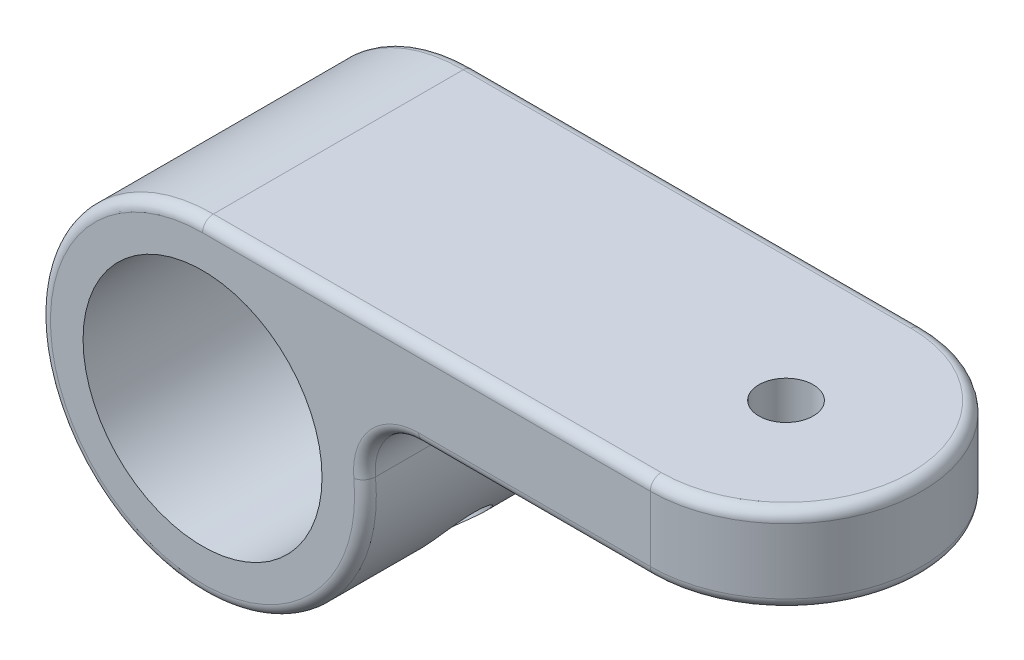
ISO-10303-21;
HEADER;
FILE_DESCRIPTION(('STEP AP214'),'2;1');
FILE_NAME('part.step','',(''),(''),'','','');
FILE_SCHEMA(('AUTOMOTIVE_DESIGN { 1 0 10303 214 1 1 1 1 }'));
ENDSEC;
DATA;
#1=APPLICATION_CONTEXT('core data for automotive mechanical design processes');
#2=APPLICATION_PROTOCOL_DEFINITION('international standard','automotive_design',2000,#1);
#3=PRODUCT_CONTEXT('',#1,'mechanical');
#4=PRODUCT('Part','Part','',(#3));
#5=PRODUCT_RELATED_PRODUCT_CATEGORY('part','',(#4));
#6=PRODUCT_DEFINITION_FORMATION('','',#4);
#7=PRODUCT_DEFINITION_CONTEXT('part definition',#1,'design');
#8=PRODUCT_DEFINITION('design','',#6,#7);
#9=PRODUCT_DEFINITION_SHAPE('','',#8);
#10=(LENGTH_UNIT() NAMED_UNIT(*) SI_UNIT(.MILLI.,.METRE.));
#11=(NAMED_UNIT(*) PLANE_ANGLE_UNIT() SI_UNIT($,.RADIAN.));
#12=(NAMED_UNIT(*) SI_UNIT($,.STERADIAN.) SOLID_ANGLE_UNIT());
#13=UNCERTAINTY_MEASURE_WITH_UNIT(LENGTH_MEASURE(1.E-05),#10,'distance_accuracy_value','');
#14=(GEOMETRIC_REPRESENTATION_CONTEXT(3) GLOBAL_UNCERTAINTY_ASSIGNED_CONTEXT((#13)) GLOBAL_UNIT_ASSIGNED_CONTEXT((#10,
#11,#12)) REPRESENTATION_CONTEXT('',''));
#15=CARTESIAN_POINT('',(0.,0.,0.));
#16=DIRECTION('',(0.,0.,1.));
#17=DIRECTION('',(1.,0.,0.));
#18=AXIS2_PLACEMENT_3D('',#15,#16,#17);
#19=CARTESIAN_POINT('',(0.,0.,12.5));
#20=DIRECTION('',(0.,0.,-1.));
#21=DIRECTION('',(-1.,0.,0.));
#22=AXIS2_PLACEMENT_3D('',#19,#20,#21);
#23=CYLINDRICAL_SURFACE('',#22,15.);
#24=CARTESIAN_POINT('',(12.5136251889729,-8.27098450185364,0.));
#25=CARTESIAN_POINT('',(12.5136231749391,-8.27099120273303,0.166693126473467));
#26=CARTESIAN_POINT('',(12.5057949052179,-8.28286904083328,0.33346387000002));
#27=CARTESIAN_POINT('',(12.4745443398884,-8.32985653781329,0.662287515429395));
#28=CARTESIAN_POINT('',(12.4511095665123,-8.36498478580651,0.82433653390794));
#29=CARTESIAN_POINT('',(12.3889022320751,-8.456840736082,1.13891191006263));
#30=CARTESIAN_POINT('',(12.3501449256236,-8.51354695394872,1.29144756459777));
#31=CARTESIAN_POINT('',(12.2576828342267,-8.64613873514985,1.58302453409087));
#32=CARTESIAN_POINT('',(12.203978883533,-8.72202322802096,1.72206660161371));
#33=CARTESIAN_POINT('',(12.0814116568911,-8.89103463466156,1.98468301156158));
#34=CARTESIAN_POINT('',(12.0123647197605,-8.9843680653555,2.10803876365192));
#35=CARTESIAN_POINT('',(11.8603688879889,-9.1840823391761,2.33387260073694));
#36=CARTESIAN_POINT('',(11.7774190195927,-9.29046409606189,2.43634922225158));
#37=CARTESIAN_POINT('',(11.5980841908886,-9.51341451016626,2.61836405288538));
#38=CARTESIAN_POINT('',(11.5015884298046,-9.63006387619198,2.69769454144992));
#39=CARTESIAN_POINT('',(11.2975614028623,-9.8686224108387,2.82982481114441));
#40=CARTESIAN_POINT('',(11.1900311711268,-9.99053108595102,2.88262707570297));
#41=CARTESIAN_POINT('',(10.967904956632,-10.2338569547666,2.95952158085887));
#42=CARTESIAN_POINT('',(10.8534207383304,-10.3552594605481,2.98398293271302));
#43=CARTESIAN_POINT('',(10.6191764386847,-10.5953388716283,3.00465285551495));
#44=CARTESIAN_POINT('',(10.4994168668352,-10.7140160384638,3.00086414893746));
#45=CARTESIAN_POINT('',(10.259898101583,-10.9435657103416,2.96542145935334));
#46=CARTESIAN_POINT('',(10.1401631900744,-11.0545252922318,2.93416506849645));
#47=CARTESIAN_POINT('',(9.90272672222236,-11.267718411485,2.84530490262332));
#48=CARTESIAN_POINT('',(9.78502524743078,-11.369951599517,2.78770007342438));
#49=CARTESIAN_POINT('',(9.55475244369862,-11.5641496484863,2.6474098795582));
#50=CARTESIAN_POINT('',(9.44221811905671,-11.6560457389459,2.56456874668534));
#51=CARTESIAN_POINT('',(9.22689422150497,-11.8272301064103,2.3762727682902));
#52=CARTESIAN_POINT('',(9.12410577185334,-11.9065169308491,2.27081532068846));
#53=CARTESIAN_POINT('',(8.93024573783684,-12.0526232229679,2.03809913367459));
#54=CARTESIAN_POINT('',(8.83940960305019,-12.1192012998987,1.91049243981123));
#55=CARTESIAN_POINT('',(8.67513365367919,-12.2373332344889,1.63825067264775));
#56=CARTESIAN_POINT('',(8.6016941681287,-12.2888868079847,1.49361527735042));
#57=CARTESIAN_POINT('',(8.47513649895263,-12.3765111113931,1.19093750453459));
#58=CARTESIAN_POINT('',(8.42206214143991,-12.412548470249,1.03286709708102));
#59=CARTESIAN_POINT('',(8.33885601052115,-12.4686014783593,0.708086028828028));
#60=CARTESIAN_POINT('',(8.30872124699857,-12.4886192157471,0.54137649714275));
#61=CARTESIAN_POINT('',(8.27312555275861,-12.5122279031537,0.207105426002867));
#62=CARTESIAN_POINT('',(8.26725124556286,-12.5160940747213,0.0396072770689794));
#63=CARTESIAN_POINT('',(8.27931650300805,-12.508116119262,-0.29414466959905));
#64=CARTESIAN_POINT('',(8.29725471728196,-12.4962728830886,-0.460398537356589));
#65=CARTESIAN_POINT('',(8.35581744160039,-12.4571875619039,-0.785305920876705));
#66=CARTESIAN_POINT('',(8.39622276567051,-12.4300942238561,-0.944017029107288));
#67=CARTESIAN_POINT('',(8.49778413555751,-12.3608825792492,-1.25118983708622));
#68=CARTESIAN_POINT('',(8.55894189075471,-12.3187630349648,-1.39965069130716));
#69=CARTESIAN_POINT('',(8.70040429506805,-12.2192680548973,-1.68423932985048));
#70=CARTESIAN_POINT('',(8.78094812014162,-12.1617009251661,-1.82018113890248));
#71=CARTESIAN_POINT('',(8.95757566976217,-12.0321985902071,-2.07392493600274));
#72=CARTESIAN_POINT('',(9.05366099360248,-11.9602619061051,-2.19172505474776));
#73=CARTESIAN_POINT('',(9.25939610818704,-11.8017233327642,-2.40768767755673));
#74=CARTESIAN_POINT('',(9.36923148455564,-11.7149132697107,-2.50552096394999));
#75=CARTESIAN_POINT('',(9.59728466765588,-11.5288227694577,-2.67643764449875));
#76=CARTESIAN_POINT('',(9.71550212211229,-11.429542856196,-2.74952207803434));
#77=CARTESIAN_POINT('',(9.95550541584014,-11.2210965065809,-2.8683866152399));
#78=CARTESIAN_POINT('',(10.0772667813548,-11.1119903052991,-2.91432155467876));
#79=CARTESIAN_POINT('',(10.3209508821267,-10.8860258816469,-2.97807374299153));
#80=CARTESIAN_POINT('',(10.4428735961773,-10.7691685947155,-2.99589437842704));
#81=CARTESIAN_POINT('',(10.6809715994997,-10.5330184409466,-3.00278094288867));
#82=CARTESIAN_POINT('',(10.7972099824029,-10.4138033405241,-2.99234184136868));
#83=CARTESIAN_POINT('',(11.0229563734338,-10.1745511397289,-2.94409814835652));
#84=CARTESIAN_POINT('',(11.1324644661699,-10.0545140497108,-2.90629390095561));
#85=CARTESIAN_POINT('',(11.3418677538826,-9.81768742085471,-2.80461302372524));
#86=CARTESIAN_POINT('',(11.441784238016,-9.70089111908024,-2.74079586560708));
#87=CARTESIAN_POINT('',(11.6302839697484,-9.47408394292961,-2.58896327600667));
#88=CARTESIAN_POINT('',(11.7188663209418,-9.36407360560472,-2.5009459322865));
#89=CARTESIAN_POINT('',(11.8845696945635,-9.15288655743325,-2.30154183881615));
#90=CARTESIAN_POINT('',(11.9614827639581,-9.05188098515442,-2.18980099084868));
#91=CARTESIAN_POINT('',(12.1010609683268,-8.86442413472852,-1.94684927970369));
#92=CARTESIAN_POINT('',(12.1637227245386,-8.77797630925267,-1.81563381156023));
#93=CARTESIAN_POINT('',(12.274650308995,-8.62219395153215,-1.53576204992871));
#94=CARTESIAN_POINT('',(12.3227538008814,-8.5530537855862,-1.38693311663624));
#95=CARTESIAN_POINT('',(12.4030978971502,-8.43612682229833,-1.0772016802197));
#96=CARTESIAN_POINT('',(12.4353528926435,-8.38832065640834,-0.916310283938431));
#97=CARTESIAN_POINT('',(12.4775340324823,-8.32539252049419,-0.629212633671379));
#98=CARTESIAN_POINT('',(12.4910591391634,-8.30504116518194,-0.504643741458127));
#99=CARTESIAN_POINT('',(12.5091053277458,-8.27783484147142,-0.253398136346596));
#100=CARTESIAN_POINT('',(12.5136267200581,-8.2709794077896,-0.126721496266594));
#101=CARTESIAN_POINT('',(12.5136251889729,-8.27098450185364,0.));
#102=B_SPLINE_CURVE_WITH_KNOTS('',3,(#24,#25,#26,#27,#28,#29,#30,#31,#32,#33,#34,#35,#36,#37,
#38,#39,#40,#41,#42,#43,#44,#45,#46,#47,#48,#49,#50,#51,#52,#53,#54,#55,#56,#57,#58,#59,#60,#61,
#62,#63,#64,#65,#66,#67,#68,#69,#70,#71,#72,#73,#74,#75,#76,#77,#78,#79,#80,#81,#82,#83,#84,#85,
#86,#87,#88,#89,#90,#91,#92,#93,#94,#95,#96,#97,#98,#99,#100,#101),.UNSPECIFIED.,.T.,.F.,(4,2,2,
2,2,2,2,2,2,2,2,2,2,2,2,2,2,2,2,2,2,2,2,2,2,2,2,2,2,2,2,2,2,2,2,2,2,2,4),(0.,0.499615391608283,
0.999630717852889,1.49914949382176,1.99864039457959,2.5044675764531,3.01033020106266,
3.52060201312351,4.03082604739679,4.53432746649241,5.03778036348745,5.53406368900612,
6.03036687221251,6.5297977266691,7.02928607310198,7.5374804028745,8.04568434368161,
8.5549758951833,9.06420105048074,9.56471273413781,10.0651960358526,10.5608802534996,
11.056605310632,11.5587917932356,12.0610299861063,12.5709780520035,13.0809046989031,
13.5878944073595,14.0948230407488,14.5929305224406,15.0910317410027,15.5880005122636,
16.0850085640405,16.5900345607679,17.0951801666934,17.6057669573882,18.1158892527059,
18.4957141091448,18.8755258705644),.UNSPECIFIED.);
#103=CARTESIAN_POINT('',(12.5136251889729,-8.27098450185364,0.));
#104=VERTEX_POINT('',#103);
#105=EDGE_CURVE('E232',#104,#104,#102,.T.);
#106=ORIENTED_EDGE('',*,*,#105,.F.);
#107=EDGE_LOOP('',(#106));
#108=FACE_BOUND('',#107,.T.);
#109=DIRECTION('',(0.,0.,-1.));
#110=VECTOR('',#109,1.);
#111=CARTESIAN_POINT('',(14.9248115565993,1.5,12.5));
#112=LINE('',#111,#110);
#113=CARTESIAN_POINT('',(14.9248115565993,1.5,-11.5));
#114=VERTEX_POINT('',#113);
#115=CARTESIAN_POINT('',(14.9248115565993,1.5,11.5));
#116=VERTEX_POINT('',#115);
#117=EDGE_CURVE('E160',#114,#116,#112,.F.);
#118=ORIENTED_EDGE('',*,*,#117,.T.);
#119=CARTESIAN_POINT('',(0.,0.,11.5));
#120=DIRECTION('',(0.,0.,1.));
#121=DIRECTION('',(1.,0.,0.));
#122=AXIS2_PLACEMENT_3D('',#119,#120,#121);
#123=CIRCLE('',#122,15.);
#124=CARTESIAN_POINT('',(0.,15.,11.5));
#125=VERTEX_POINT('',#124);
#126=EDGE_CURVE('E131',#116,#125,#123,.F.);
#127=ORIENTED_EDGE('',*,*,#126,.T.);
#128=DIRECTION('',(0.,0.,1.));
#129=VECTOR('',#128,1.);
#130=CARTESIAN_POINT('',(0.,15.,-12.5));
#131=LINE('',#130,#129);
#132=CARTESIAN_POINT('',(0.,15.,-11.5));
#133=VERTEX_POINT('',#132);
#134=EDGE_CURVE('E137',#133,#125,#131,.T.);
#135=ORIENTED_EDGE('',*,*,#134,.F.);
#136=CARTESIAN_POINT('',(0.,0.,-11.5));
#137=DIRECTION('',(0.,0.,1.));
#138=DIRECTION('',(1.,0.,0.));
#139=AXIS2_PLACEMENT_3D('',#136,#137,#138);
#140=CIRCLE('',#139,15.);
#141=EDGE_CURVE('E123',#133,#114,#140,.T.);
#142=ORIENTED_EDGE('',*,*,#141,.T.);
#143=EDGE_LOOP('',(#118,#127,#135,#142));
#144=FACE_BOUND('',#143,.T.);
#145=ADVANCED_FACE('F34',(#108,#144),#23,.T.);
#146=CARTESIAN_POINT('',(0.,0.,12.5));
#147=DIRECTION('',(0.,0.,1.));
#148=DIRECTION('',(1.,0.,0.));
#149=AXIS2_PLACEMENT_3D('',#146,#147,#148);
#150=PLANE('',#149);
#151=CARTESIAN_POINT('',(0.,0.,12.5));
#152=DIRECTION('',(0.,0.,-1.));
#153=DIRECTION('',(-1.,0.,0.));
#154=AXIS2_PLACEMENT_3D('',#151,#152,#153);
#155=CIRCLE('',#154,11.);
#156=CARTESIAN_POINT('',(-11.,0.,12.5));
#157=VERTEX_POINT('',#156);
#158=EDGE_CURVE('E146',#157,#157,#155,.T.);
#159=ORIENTED_EDGE('',*,*,#158,.T.);
#160=EDGE_LOOP('',(#159));
#161=FACE_BOUND('',#160,.T.);
#162=DIRECTION('',(0.,1.,0.));
#163=VECTOR('',#162,1.);
#164=CARTESIAN_POINT('',(41.2189778502514,7.,12.5));
#165=LINE('',#164,#163);
#166=CARTESIAN_POINT('',(41.2189778502514,8.,12.5));
#167=VERTEX_POINT('',#166);
#168=CARTESIAN_POINT('',(41.2189778502514,14.,12.5));
#169=VERTEX_POINT('',#168);
#170=EDGE_CURVE('E149',#167,#169,#165,.T.);
#171=ORIENTED_EDGE('',*,*,#170,.T.);
#172=DIRECTION('',(1.,0.,0.));
#173=VECTOR('',#172,1.);
#174=CARTESIAN_POINT('',(0.,14.,12.5));
#175=LINE('',#174,#173);
#176=CARTESIAN_POINT('',(0.,14.,12.5));
#177=VERTEX_POINT('',#176);
#178=EDGE_CURVE('E132',#169,#177,#175,.F.);
#179=ORIENTED_EDGE('',*,*,#178,.T.);
#180=CARTESIAN_POINT('',(0.,0.,12.5));
#181=DIRECTION('',(0.,0.,1.));
#182=DIRECTION('',(1.,0.,0.));
#183=AXIS2_PLACEMENT_3D('',#180,#181,#182);
#184=CIRCLE('',#183,14.);
#185=CARTESIAN_POINT('',(13.9298241194927,1.4,12.5));
#186=VERTEX_POINT('',#185);
#187=EDGE_CURVE('E179',#177,#186,#184,.T.);
#188=ORIENTED_EDGE('',*,*,#187,.T.);
#189=CARTESIAN_POINT('',(19.8997487421324,2.,12.5));
#190=DIRECTION('',(0.,0.,1.));
#191=DIRECTION('',(1.,0.,0.));
#192=AXIS2_PLACEMENT_3D('',#189,#190,#191);
#193=CIRCLE('',#192,6.);
#194=CARTESIAN_POINT('',(19.8997487421324,8.,12.5));
#195=VERTEX_POINT('',#194);
#196=EDGE_CURVE('E177',#186,#195,#193,.F.);
#197=ORIENTED_EDGE('',*,*,#196,.T.);
#198=DIRECTION('',(1.,0.,0.));
#199=VECTOR('',#198,1.);
#200=CARTESIAN_POINT('',(41.2189778502514,8.,12.5));
#201=LINE('',#200,#199);
#202=EDGE_CURVE('E175',#195,#167,#201,.T.);
#203=ORIENTED_EDGE('',*,*,#202,.T.);
#204=EDGE_LOOP('',(#171,#179,#188,#197,#203));
#205=FACE_BOUND('',#204,.T.);
#206=ADVANCED_FACE('F253',(#161,#205),#150,.T.);
#207=CARTESIAN_POINT('',(0.,0.,-12.5));
#208=DIRECTION('',(0.,0.,1.));
#209=DIRECTION('',(1.,0.,0.));
#210=AXIS2_PLACEMENT_3D('',#207,#208,#209);
#211=PLANE('',#210);
#212=CARTESIAN_POINT('',(0.,0.,-12.5));
#213=DIRECTION('',(0.,0.,-1.));
#214=DIRECTION('',(-1.,0.,0.));
#215=AXIS2_PLACEMENT_3D('',#212,#213,#214);
#216=CIRCLE('',#215,11.);
#217=CARTESIAN_POINT('',(-11.,0.,-12.5));
#218=VERTEX_POINT('',#217);
#219=EDGE_CURVE('E152',#218,#218,#216,.T.);
#220=ORIENTED_EDGE('',*,*,#219,.F.);
#221=EDGE_LOOP('',(#220));
#222=FACE_BOUND('',#221,.T.);
#223=CARTESIAN_POINT('',(0.,0.,-12.5));
#224=DIRECTION('',(0.,0.,1.));
#225=DIRECTION('',(1.,0.,0.));
#226=AXIS2_PLACEMENT_3D('',#223,#224,#225);
#227=CIRCLE('',#226,14.);
#228=CARTESIAN_POINT('',(13.9298241194927,1.4,-12.5));
#229=VERTEX_POINT('',#228);
#230=CARTESIAN_POINT('',(0.,14.,-12.5));
#231=VERTEX_POINT('',#230);
#232=EDGE_CURVE('E142',#229,#231,#227,.F.);
#233=ORIENTED_EDGE('',*,*,#232,.T.);
#234=DIRECTION('',(-1.,0.,0.));
#235=VECTOR('',#234,1.);
#236=CARTESIAN_POINT('',(41.2189778502514,14.,-12.5));
#237=LINE('',#236,#235);
#238=CARTESIAN_POINT('',(41.2189778502514,14.,-12.5));
#239=VERTEX_POINT('',#238);
#240=EDGE_CURVE('E117',#231,#239,#237,.F.);
#241=ORIENTED_EDGE('',*,*,#240,.T.);
#242=DIRECTION('',(0.,1.,0.));
#243=VECTOR('',#242,1.);
#244=CARTESIAN_POINT('',(41.2189778502514,7.,-12.5));
#245=LINE('',#244,#243);
#246=CARTESIAN_POINT('',(41.2189778502514,8.,-12.5));
#247=VERTEX_POINT('',#246);
#248=EDGE_CURVE('E145',#247,#239,#245,.T.);
#249=ORIENTED_EDGE('',*,*,#248,.F.);
#250=DIRECTION('',(-1.,0.,0.));
#251=VECTOR('',#250,1.);
#252=CARTESIAN_POINT('',(0.,8.,-12.5));
#253=LINE('',#252,#251);
#254=CARTESIAN_POINT('',(19.8997487421324,8.,-12.5));
#255=VERTEX_POINT('',#254);
#256=EDGE_CURVE('E168',#247,#255,#253,.T.);
#257=ORIENTED_EDGE('',*,*,#256,.T.);
#258=CARTESIAN_POINT('',(19.8997487421324,2.,-12.5));
#259=DIRECTION('',(0.,0.,1.));
#260=DIRECTION('',(1.,0.,0.));
#261=AXIS2_PLACEMENT_3D('',#258,#259,#260);
#262=CIRCLE('',#261,6.);
#263=EDGE_CURVE('E166',#255,#229,#262,.T.);
#264=ORIENTED_EDGE('',*,*,#263,.T.);
#265=EDGE_LOOP('',(#233,#241,#249,#257,#264));
#266=FACE_BOUND('',#265,.T.);
#267=ADVANCED_FACE('F259',(#222,#266),#211,.F.);
#268=CARTESIAN_POINT('',(41.2189778502514,7.,0.));
#269=DIRECTION('',(0.,1.,0.));
#270=DIRECTION('',(0.,0.,1.));
#271=AXIS2_PLACEMENT_3D('',#268,#269,#270);
#272=PLANE('',#271);
#273=CARTESIAN_POINT('',(41.2189778502514,7.,0.));
#274=DIRECTION('',(0.,1.,0.));
#275=DIRECTION('',(0.,0.,1.));
#276=AXIS2_PLACEMENT_3D('',#273,#274,#275);
#277=CIRCLE('',#276,2.49999999999999);
#278=CARTESIAN_POINT('',(41.2189778502514,7.,2.49999999999999));
#279=VERTEX_POINT('',#278);
#280=EDGE_CURVE('E217',#279,#279,#277,.T.);
#281=ORIENTED_EDGE('',*,*,#280,.T.);
#282=EDGE_LOOP('',(#281));
#283=FACE_BOUND('',#282,.T.);
#284=CARTESIAN_POINT('',(41.2189778502514,7.,0.));
#285=DIRECTION('',(0.,1.,0.));
#286=DIRECTION('',(0.,0.,1.));
#287=AXIS2_PLACEMENT_3D('',#284,#285,#286);
#288=CIRCLE('',#287,11.5);
#289=CARTESIAN_POINT('',(41.2189778502514,7.,-11.5));
#290=VERTEX_POINT('',#289);
#291=CARTESIAN_POINT('',(41.2189778502514,7.,11.5));
#292=VERTEX_POINT('',#291);
#293=EDGE_CURVE('E43',#290,#292,#288,.F.);
#294=ORIENTED_EDGE('',*,*,#293,.T.);
#295=DIRECTION('',(1.,0.,0.));
#296=VECTOR('',#295,1.);
#297=CARTESIAN_POINT('',(19.8997487421324,7.,11.5));
#298=LINE('',#297,#296);
#299=CARTESIAN_POINT('',(19.8997487421324,7.,11.5));
#300=VERTEX_POINT('',#299);
#301=EDGE_CURVE('E11',#292,#300,#298,.F.);
#302=ORIENTED_EDGE('',*,*,#301,.T.);
#303=DIRECTION('',(0.,0.,1.));
#304=VECTOR('',#303,1.);
#305=CARTESIAN_POINT('',(19.8997487421324,7.,-12.5));
#306=LINE('',#305,#304);
#307=CARTESIAN_POINT('',(19.8997487421324,7.,-11.5));
#308=VERTEX_POINT('',#307);
#309=EDGE_CURVE('E157',#300,#308,#306,.F.);
#310=ORIENTED_EDGE('',*,*,#309,.T.);
#311=DIRECTION('',(-1.,0.,0.));
#312=VECTOR('',#311,1.);
#313=CARTESIAN_POINT('',(41.2189778502514,7.,-11.5));
#314=LINE('',#313,#312);
#315=EDGE_CURVE('E54',#308,#290,#314,.F.);
#316=ORIENTED_EDGE('',*,*,#315,.T.);
#317=EDGE_LOOP('',(#294,#302,#310,#316));
#318=FACE_BOUND('',#317,.T.);
#319=ADVANCED_FACE('F394',(#283,#318),#272,.F.);
#320=CARTESIAN_POINT('',(41.2189778502514,7.,0.));
#321=DIRECTION('',(0.,1.,0.));
#322=DIRECTION('',(0.,0.,1.));
#323=AXIS2_PLACEMENT_3D('',#320,#321,#322);
#324=CYLINDRICAL_SURFACE('',#323,12.5);
#325=ORIENTED_EDGE('',*,*,#248,.T.);
#326=CARTESIAN_POINT('',(41.2189778502514,14.,0.));
#327=DIRECTION('',(0.,1.,0.));
#328=DIRECTION('',(0.,0.,1.));
#329=AXIS2_PLACEMENT_3D('',#326,#327,#328);
#330=CIRCLE('',#329,12.5);
#331=EDGE_CURVE('E173',#239,#169,#330,.F.);
#332=ORIENTED_EDGE('',*,*,#331,.T.);
#333=ORIENTED_EDGE('',*,*,#170,.F.);
#334=CARTESIAN_POINT('',(41.2189778502514,8.,0.));
#335=DIRECTION('',(0.,1.,0.));
#336=DIRECTION('',(0.,0.,1.));
#337=AXIS2_PLACEMENT_3D('',#334,#335,#336);
#338=CIRCLE('',#337,12.5);
#339=EDGE_CURVE('E171',#167,#247,#338,.T.);
#340=ORIENTED_EDGE('',*,*,#339,.T.);
#341=EDGE_LOOP('',(#325,#332,#333,#340));
#342=FACE_BOUND('',#341,.T.);
#343=ADVANCED_FACE('F385',(#342),#324,.T.);
#344=CARTESIAN_POINT('',(41.2189778502514,15.,0.));
#345=DIRECTION('',(0.,1.,0.));
#346=DIRECTION('',(0.,0.,1.));
#347=AXIS2_PLACEMENT_3D('',#344,#345,#346);
#348=PLANE('',#347);
#349=CARTESIAN_POINT('',(41.2189778502514,15.,0.));
#350=DIRECTION('',(0.,1.,0.));
#351=DIRECTION('',(0.,0.,1.));
#352=AXIS2_PLACEMENT_3D('',#349,#350,#351);
#353=CIRCLE('',#352,2.49999999999999);
#354=CARTESIAN_POINT('',(41.2189778502514,15.,2.49999999999999));
#355=VERTEX_POINT('',#354);
#356=EDGE_CURVE('E211',#355,#355,#353,.T.);
#357=ORIENTED_EDGE('',*,*,#356,.F.);
#358=EDGE_LOOP('',(#357));
#359=FACE_BOUND('',#358,.T.);
#360=CARTESIAN_POINT('',(41.2189778502514,15.,0.));
#361=DIRECTION('',(0.,1.,0.));
#362=DIRECTION('',(0.,0.,1.));
#363=AXIS2_PLACEMENT_3D('',#360,#361,#362);
#364=CIRCLE('',#363,11.5);
#365=CARTESIAN_POINT('',(41.2189778502514,15.,11.5));
#366=VERTEX_POINT('',#365);
#367=CARTESIAN_POINT('',(41.2189778502514,15.,-11.5));
#368=VERTEX_POINT('',#367);
#369=EDGE_CURVE('E140',#366,#368,#364,.T.);
#370=ORIENTED_EDGE('',*,*,#369,.T.);
#371=DIRECTION('',(-1.,0.,0.));
#372=VECTOR('',#371,1.);
#373=CARTESIAN_POINT('',(0.,15.,-11.5));
#374=LINE('',#373,#372);
#375=EDGE_CURVE('E115',#368,#133,#374,.T.);
#376=ORIENTED_EDGE('',*,*,#375,.T.);
#377=ORIENTED_EDGE('',*,*,#134,.T.);
#378=DIRECTION('',(1.,0.,0.));
#379=VECTOR('',#378,1.);
#380=CARTESIAN_POINT('',(41.2189778502514,15.,11.5));
#381=LINE('',#380,#379);
#382=EDGE_CURVE('E162',#125,#366,#381,.T.);
#383=ORIENTED_EDGE('',*,*,#382,.T.);
#384=EDGE_LOOP('',(#370,#376,#377,#383));
#385=FACE_BOUND('',#384,.T.);
#386=ADVANCED_FACE('F136',(#359,#385),#348,.T.);
#387=CARTESIAN_POINT('',(19.8997487421324,2.,12.5));
#388=DIRECTION('',(0.,0.,-1.));
#389=DIRECTION('',(-1.,0.,0.));
#390=AXIS2_PLACEMENT_3D('',#387,#388,#389);
#391=CYLINDRICAL_SURFACE('',#390,5.);
#392=ORIENTED_EDGE('',*,*,#309,.F.);
#393=CARTESIAN_POINT('',(19.8997487421324,2.,11.5));
#394=DIRECTION('',(0.,0.,1.));
#395=DIRECTION('',(1.,0.,0.));
#396=AXIS2_PLACEMENT_3D('',#393,#394,#395);
#397=CIRCLE('',#396,5.);
#398=EDGE_CURVE('E185',#300,#116,#397,.T.);
#399=ORIENTED_EDGE('',*,*,#398,.T.);
#400=ORIENTED_EDGE('',*,*,#117,.F.);
#401=CARTESIAN_POINT('',(19.8997487421324,2.,-11.5));
#402=DIRECTION('',(0.,0.,1.));
#403=DIRECTION('',(1.,0.,0.));
#404=AXIS2_PLACEMENT_3D('',#401,#402,#403);
#405=CIRCLE('',#404,5.);
#406=EDGE_CURVE('E183',#114,#308,#405,.F.);
#407=ORIENTED_EDGE('',*,*,#406,.T.);
#408=EDGE_LOOP('',(#392,#399,#400,#407));
#409=FACE_BOUND('',#408,.T.);
#410=ADVANCED_FACE('F265',(#409),#391,.F.);
#411=CARTESIAN_POINT('',(0.,0.,12.5));
#412=DIRECTION('',(0.,0.,-1.));
#413=DIRECTION('',(-1.,0.,0.));
#414=AXIS2_PLACEMENT_3D('',#411,#412,#413);
#415=CYLINDRICAL_SURFACE('',#414,11.);
#416=CARTESIAN_POINT('',(9.60463511710751,-5.36199442998826,0.));
#417=CARTESIAN_POINT('',(9.60463443006475,-5.36199895581847,-0.165112902057717));
#418=CARTESIAN_POINT('',(9.59772579887576,-5.37442811429743,-0.330264219911617));
#419=CARTESIAN_POINT('',(9.57009139923725,-5.42347834183188,-0.655787050599415));
#420=CARTESIAN_POINT('',(9.54935911182632,-5.46011082461969,-0.816156270996935));
#421=CARTESIAN_POINT('',(9.4941303050645,-5.55558302118491,-1.12735837592386));
#422=CARTESIAN_POINT('',(9.45965374301011,-5.61439052916973,-1.27820472180849));
#423=CARTESIAN_POINT('',(9.37696422654692,-5.75142767581114,-1.56671626847336));
#424=CARTESIAN_POINT('',(9.32875002652241,-5.8296590755833,-1.70438027247458));
#425=CARTESIAN_POINT('',(9.2173599453906,-6.00426713170295,-1.96622041358269));
#426=CARTESIAN_POINT('',(9.15385724659032,-6.101029099833,-2.0900006567561));
#427=CARTESIAN_POINT('',(9.01280443023725,-6.30753260241041,-2.31705531545098));
#428=CARTESIAN_POINT('',(8.93525280104236,-6.41727553314685,-2.42032752183202));
#429=CARTESIAN_POINT('',(8.76532438690944,-6.64754638693444,-2.60509725362096));
#430=CARTESIAN_POINT('',(8.6727202469165,-6.76822462890474,-2.68619944365289));
#431=CARTESIAN_POINT('',(8.47499853924056,-7.0142185671129,-2.82174573636573));
#432=CARTESIAN_POINT('',(8.36988318658457,-7.13953343976681,-2.87619454914844));
#433=CARTESIAN_POINT('',(8.151988024963,-7.38726207679906,-2.95560219656108));
#434=CARTESIAN_POINT('',(8.039451509514,-7.50967357949618,-2.98123488842947));
#435=CARTESIAN_POINT('',(7.80749109046237,-7.75054955911131,-3.00440460459591));
#436=CARTESIAN_POINT('',(7.68806839417813,-7.86901472220906,-3.00194653908894));
#437=CARTESIAN_POINT('',(7.44917478303897,-8.09544226846508,-2.96947520270322));
#438=CARTESIAN_POINT('',(7.32978817924872,-8.20359922914751,-2.94019025336151));
#439=CARTESIAN_POINT('',(7.09169119783908,-8.41027848140167,-2.8560753353088));
#440=CARTESIAN_POINT('',(6.9729808600516,-8.50880021087454,-2.8012438773432));
#441=CARTESIAN_POINT('',(6.73895057816217,-8.69535449139913,-2.66704572831408));
#442=CARTESIAN_POINT('',(6.62367790965727,-8.78326906563586,-2.58743310262504));
#443=CARTESIAN_POINT('',(6.40176806439386,-8.94630389009055,-2.40612221146475));
#444=CARTESIAN_POINT('',(6.29513264327777,-9.02142154255979,-2.30441947125565));
#445=CARTESIAN_POINT('',(6.09111038642808,-9.1604650514687,-2.07796400976));
#446=CARTESIAN_POINT('',(5.99412984442713,-9.22395471105038,-1.95257665612493));
#447=CARTESIAN_POINT('',(5.81743993183889,-9.33640141241082,-1.68430956976681));
#448=CARTESIAN_POINT('',(5.73773171689146,-9.38535748187147,-1.54142866760295));
#449=CARTESIAN_POINT('',(5.59875081427746,-9.46893021424181,-1.24089121201835));
#450=CARTESIAN_POINT('',(5.53961876843446,-9.5034485038946,-1.08314198853184));
#451=CARTESIAN_POINT('',(5.44561438023737,-9.55762839778143,-0.758154795623372));
#452=CARTESIAN_POINT('',(5.41073570191186,-9.57729388229131,-0.590919316756091));
#453=CARTESIAN_POINT('',(5.36787312482913,-9.60138156918398,-0.257295636951545));
#454=CARTESIAN_POINT('',(5.35908449500411,-9.60625997284642,-0.091043626450415));
#455=CARTESIAN_POINT('',(5.36659849109299,-9.60206438097145,0.240702287088641));
#456=CARTESIAN_POINT('',(5.38289830626255,-9.59299194839407,0.406196272967353));
#457=CARTESIAN_POINT('',(5.43909622386753,-9.56123567548758,0.728244874614174));
#458=CARTESIAN_POINT('',(5.47850768672521,-9.53883239096619,0.884912841257285));
#459=CARTESIAN_POINT('',(5.57855800688833,-9.48066545399861,1.18869201986353));
#460=CARTESIAN_POINT('',(5.63919972929203,-9.4448999982366,1.335801938756));
#461=CARTESIAN_POINT('',(5.78056013707272,-9.35906466129004,1.62000141633334));
#462=CARTESIAN_POINT('',(5.86170597174865,-9.3086865590557,1.75678514900979));
#463=CARTESIAN_POINT('',(6.03988439192025,-9.19407395959984,2.01313213077045));
#464=CARTESIAN_POINT('',(6.13692010571028,-9.12983673309322,2.1326919802003));
#465=CARTESIAN_POINT('',(6.34626962519233,-8.98562590865305,2.35493272790115));
#466=CARTESIAN_POINT('',(6.4589582109775,-8.90523328719244,2.45699000686839));
#467=CARTESIAN_POINT('',(6.69288449075973,-8.73078195314261,2.63674127018198));
#468=CARTESIAN_POINT('',(6.81412172952374,-8.63672396797917,2.71443655065564));
#469=CARTESIAN_POINT('',(7.05971364851532,-8.43713598728779,2.84253413251583));
#470=CARTESIAN_POINT('',(7.18403717499331,-8.33169980259407,2.89314178060099));
#471=CARTESIAN_POINT('',(7.43226131230088,-8.11104384163859,2.96621390509015));
#472=CARTESIAN_POINT('',(7.55616201481069,-7.99582634772228,2.98868492765384));
#473=CARTESIAN_POINT('',(7.79548710309552,-7.76256500422248,3.00442024018115));
#474=CARTESIAN_POINT('',(7.91105588022206,-7.64473002446613,2.99859734261346));
#475=CARTESIAN_POINT('',(8.13465280004792,-7.40635740962586,2.96004044537997));
#476=CARTESIAN_POINT('',(8.24268124921716,-7.28581988464789,2.92730754013925));
#477=CARTESIAN_POINT('',(8.44787989849338,-7.04684105435847,2.83638525932124));
#478=CARTESIAN_POINT('',(8.54512544285492,-6.92839080813516,2.7783886035202));
#479=CARTESIAN_POINT('',(8.72799122145497,-6.69656573175011,2.63875675692911));
#480=CARTESIAN_POINT('',(8.81360976630816,-6.5831916407467,2.55711813638421));
#481=CARTESIAN_POINT('',(8.97438225385039,-6.36236183553424,2.36989054343922));
#482=CARTESIAN_POINT('',(9.04918146865418,-6.25515638081133,2.26370185513661));
#483=CARTESIAN_POINT('',(9.18486227578806,-6.05417539402211,2.03151572288963));
#484=CARTESIAN_POINT('',(9.24574014429521,-5.96040345778932,1.90551299406044));
#485=CARTESIAN_POINT('',(9.35459100992225,-5.7881150711914,1.63374494637179));
#486=CARTESIAN_POINT('',(9.40223030753362,-5.71000493912968,1.48758759477228));
#487=CARTESIAN_POINT('',(9.4825771695016,-5.57556312371175,1.18182810983632));
#488=CARTESIAN_POINT('',(9.51529407206618,-5.51921782364419,1.02223445901635));
#489=CARTESIAN_POINT('',(9.56190932868506,-5.4379887262448,0.719463961469247));
#490=CARTESIAN_POINT('',(9.57792961484092,-5.40959648201826,0.577543062490048));
#491=CARTESIAN_POINT('',(9.59929213559822,-5.37159853214167,0.290424404201468));
#492=CARTESIAN_POINT('',(9.60463572140434,-5.36199044923923,0.145227061899352));
#493=CARTESIAN_POINT('',(9.60463511710751,-5.36199442998826,0.));
#494=B_SPLINE_CURVE_WITH_KNOTS('',3,(#416,#417,#418,#419,#420,#421,#422,#423,#424,#425,#426,
#427,#428,#429,#430,#431,#432,#433,#434,#435,#436,#437,#438,#439,#440,#441,#442,#443,#444,#445,
#446,#447,#448,#449,#450,#451,#452,#453,#454,#455,#456,#457,#458,#459,#460,#461,#462,#463,#464,
#465,#466,#467,#468,#469,#470,#471,#472,#473,#474,#475,#476,#477,#478,#479,#480,#481,#482,#483,
#484,#485,#486,#487,#488,#489,#490,#491,#492,#493),.UNSPECIFIED.,.T.,.F.,(4,2,2,2,2,2,2,2,2,2,2,
2,2,2,2,2,2,2,2,2,2,2,2,2,2,2,2,2,2,2,2,2,2,2,2,2,2,2,4),(0.,0.494804402783935,
0.989842310673483,1.48416400458282,1.9785305337777,2.48458654001651,2.99069702943608,
3.5053176563917,4.01984730833293,4.52207686042122,5.02421862536768,5.51311924771327,
6.00204837448659,6.49599339426235,6.99003856468468,7.49992833732446,8.00985221464115,
8.52319603663078,9.03640570178773,9.53361223089933,10.0307630603168,10.5178037490719,
11.0049101910351,11.5031485099097,12.0014850368415,12.5149711336561,13.0284299069195,
13.5379390354896,14.0473296015752,14.5403975209342,15.0334453883032,15.5227962513149,
16.0122181403599,16.5151701080202,17.0182564534142,17.5330636246647,18.0475481939114,
18.4828145157885,18.9180257484398),.UNSPECIFIED.);
#495=CARTESIAN_POINT('',(9.60463511710751,-5.36199442998826,0.));
#496=VERTEX_POINT('',#495);
#497=EDGE_CURVE('E222',#496,#496,#494,.T.);
#498=ORIENTED_EDGE('',*,*,#497,.F.);
#499=EDGE_LOOP('',(#498));
#500=FACE_BOUND('',#499,.T.);
#501=ORIENTED_EDGE('',*,*,#158,.F.);
#502=EDGE_LOOP('',(#501));
#503=FACE_BOUND('',#502,.T.);
#504=ORIENTED_EDGE('',*,*,#219,.T.);
#505=EDGE_LOOP('',(#504));
#506=FACE_BOUND('',#505,.T.);
#507=ADVANCED_FACE('F249',(#500,#503,#506),#415,.F.);
#508=CARTESIAN_POINT('',(-15.001,15.001,0.));
#509=DIRECTION('',(0.707106781186546,-0.707106781186549,0.));
#510=DIRECTION('',(0.707106781186549,0.707106781186546,0.));
#511=AXIS2_PLACEMENT_3D('',#508,#509,#510);
#512=CYLINDRICAL_SURFACE('',#511,3.);
#513=ORIENTED_EDGE('',*,*,#497,.T.);
#514=EDGE_LOOP('',(#513));
#515=FACE_BOUND('',#514,.T.);
#516=ORIENTED_EDGE('',*,*,#105,.T.);
#517=EDGE_LOOP('',(#516));
#518=FACE_BOUND('',#517,.T.);
#519=ADVANCED_FACE('F237',(#515,#518),#512,.F.);
#520=CARTESIAN_POINT('',(41.2189778502514,15.,0.));
#521=DIRECTION('',(0.,1.,0.));
#522=DIRECTION('',(0.,0.,1.));
#523=AXIS2_PLACEMENT_3D('',#520,#521,#522);
#524=CYLINDRICAL_SURFACE('',#523,2.49999999999999);
#525=ORIENTED_EDGE('',*,*,#356,.T.);
#526=EDGE_LOOP('',(#525));
#527=FACE_BOUND('',#526,.T.);
#528=ORIENTED_EDGE('',*,*,#280,.F.);
#529=EDGE_LOOP('',(#528));
#530=FACE_BOUND('',#529,.T.);
#531=ADVANCED_FACE('F241',(#527,#530),#524,.F.);
#532=CARTESIAN_POINT('',(0.,8.,11.5));
#533=DIRECTION('',(-1.,0.,0.));
#534=DIRECTION('',(0.,0.,1.));
#535=AXIS2_PLACEMENT_3D('',#532,#533,#534);
#536=CYLINDRICAL_SURFACE('',#535,1.);
#537=CARTESIAN_POINT('',(41.2189778502514,8.,11.5));
#538=DIRECTION('',(1.,0.,0.));
#539=DIRECTION('',(0.,0.,-1.));
#540=AXIS2_PLACEMENT_3D('',#537,#538,#539);
#541=CIRCLE('',#540,1.);
#542=EDGE_CURVE('E205',#167,#292,#541,.T.);
#543=ORIENTED_EDGE('',*,*,#542,.F.);
#544=ORIENTED_EDGE('',*,*,#202,.F.);
#545=CARTESIAN_POINT('',(19.8997487421324,8.,11.5));
#546=DIRECTION('',(-1.,0.,0.));
#547=DIRECTION('',(0.,0.,1.));
#548=AXIS2_PLACEMENT_3D('',#545,#546,#547);
#549=CIRCLE('',#548,1.);
#550=EDGE_CURVE('E38',#300,#195,#549,.T.);
#551=ORIENTED_EDGE('',*,*,#550,.F.);
#552=ORIENTED_EDGE('',*,*,#301,.F.);
#553=EDGE_LOOP('',(#543,#544,#551,#552));
#554=FACE_BOUND('',#553,.T.);
#555=ADVANCED_FACE('F36',(#554),#536,.T.);
#556=CARTESIAN_POINT('',(19.8997487421324,2.,11.5));
#557=DIRECTION('',(0.,0.,1.));
#558=DIRECTION('',(1.,0.,0.));
#559=AXIS2_PLACEMENT_3D('',#556,#557,#558);
#560=TOROIDAL_SURFACE('',#559,6.,1.);
#561=ORIENTED_EDGE('',*,*,#550,.T.);
#562=ORIENTED_EDGE('',*,*,#196,.F.);
#563=CARTESIAN_POINT('',(13.9298241194927,1.4,11.5));
#564=DIRECTION('',(0.1,-0.99498743710662,0.));
#565=DIRECTION('',(0.99498743710662,0.1,0.));
#566=AXIS2_PLACEMENT_3D('',#563,#564,#565);
#567=CIRCLE('',#566,1.);
#568=EDGE_CURVE('E203',#116,#186,#567,.T.);
#569=ORIENTED_EDGE('',*,*,#568,.F.);
#570=ORIENTED_EDGE('',*,*,#398,.F.);
#571=EDGE_LOOP('',(#561,#562,#569,#570));
#572=FACE_BOUND('',#571,.T.);
#573=ADVANCED_FACE('F247',(#572),#560,.T.);
#574=CARTESIAN_POINT('',(41.2189778502514,8.,0.));
#575=DIRECTION('',(0.,1.,0.));
#576=DIRECTION('',(0.,0.,1.));
#577=AXIS2_PLACEMENT_3D('',#574,#575,#576);
#578=TOROIDAL_SURFACE('',#577,11.5,1.);
#579=ORIENTED_EDGE('',*,*,#542,.T.);
#580=ORIENTED_EDGE('',*,*,#293,.F.);
#581=CARTESIAN_POINT('',(41.2189778502514,8.,-11.5));
#582=DIRECTION('',(-1.,0.,0.));
#583=DIRECTION('',(0.,0.,1.));
#584=AXIS2_PLACEMENT_3D('',#581,#582,#583);
#585=CIRCLE('',#584,1.);
#586=EDGE_CURVE('E200',#247,#290,#585,.T.);
#587=ORIENTED_EDGE('',*,*,#586,.F.);
#588=ORIENTED_EDGE('',*,*,#339,.F.);
#589=EDGE_LOOP('',(#579,#580,#587,#588));
#590=FACE_BOUND('',#589,.T.);
#591=ADVANCED_FACE('F292',(#590),#578,.T.);
#592=CARTESIAN_POINT('',(0.,0.,11.5));
#593=DIRECTION('',(0.,0.,1.));
#594=DIRECTION('',(1.,0.,0.));
#595=AXIS2_PLACEMENT_3D('',#592,#593,#594);
#596=TOROIDAL_SURFACE('',#595,14.,1.);
#597=ORIENTED_EDGE('',*,*,#568,.T.);
#598=ORIENTED_EDGE('',*,*,#187,.F.);
#599=CARTESIAN_POINT('',(0.,14.,11.5));
#600=DIRECTION('',(1.,0.,0.));
#601=DIRECTION('',(0.,0.,-1.));
#602=AXIS2_PLACEMENT_3D('',#599,#600,#601);
#603=CIRCLE('',#602,1.);
#604=EDGE_CURVE('E197',#125,#177,#603,.T.);
#605=ORIENTED_EDGE('',*,*,#604,.F.);
#606=ORIENTED_EDGE('',*,*,#126,.F.);
#607=EDGE_LOOP('',(#597,#598,#605,#606));
#608=FACE_BOUND('',#607,.T.);
#609=ADVANCED_FACE('F288',(#608),#596,.T.);
#610=CARTESIAN_POINT('',(0.,8.,-11.5));
#611=DIRECTION('',(-1.,0.,0.));
#612=DIRECTION('',(0.,0.,1.));
#613=AXIS2_PLACEMENT_3D('',#610,#611,#612);
#614=CYLINDRICAL_SURFACE('',#613,1.);
#615=ORIENTED_EDGE('',*,*,#586,.T.);
#616=ORIENTED_EDGE('',*,*,#315,.F.);
#617=CARTESIAN_POINT('',(19.8997487421324,8.,-11.5));
#618=DIRECTION('',(-1.,0.,0.));
#619=DIRECTION('',(0.,0.,1.));
#620=AXIS2_PLACEMENT_3D('',#617,#618,#619);
#621=CIRCLE('',#620,1.);
#622=EDGE_CURVE('E194',#255,#308,#621,.T.);
#623=ORIENTED_EDGE('',*,*,#622,.F.);
#624=ORIENTED_EDGE('',*,*,#256,.F.);
#625=EDGE_LOOP('',(#615,#616,#623,#624));
#626=FACE_BOUND('',#625,.T.);
#627=ADVANCED_FACE('F284',(#626),#614,.T.);
#628=CARTESIAN_POINT('',(41.2189778502514,14.,11.5));
#629=DIRECTION('',(1.,0.,0.));
#630=DIRECTION('',(0.,0.,-1.));
#631=AXIS2_PLACEMENT_3D('',#628,#629,#630);
#632=CYLINDRICAL_SURFACE('',#631,1.);
#633=ORIENTED_EDGE('',*,*,#604,.T.);
#634=ORIENTED_EDGE('',*,*,#178,.F.);
#635=CARTESIAN_POINT('',(41.2189778502514,14.,11.5));
#636=DIRECTION('',(1.,0.,0.));
#637=DIRECTION('',(0.,0.,-1.));
#638=AXIS2_PLACEMENT_3D('',#635,#636,#637);
#639=CIRCLE('',#638,1.);
#640=EDGE_CURVE('E191',#366,#169,#639,.T.);
#641=ORIENTED_EDGE('',*,*,#640,.F.);
#642=ORIENTED_EDGE('',*,*,#382,.F.);
#643=EDGE_LOOP('',(#633,#634,#641,#642));
#644=FACE_BOUND('',#643,.T.);
#645=ADVANCED_FACE('F280',(#644),#632,.T.);
#646=CARTESIAN_POINT('',(19.8997487421324,2.,-11.5));
#647=DIRECTION('',(0.,0.,1.));
#648=DIRECTION('',(1.,0.,0.));
#649=AXIS2_PLACEMENT_3D('',#646,#647,#648);
#650=TOROIDAL_SURFACE('',#649,6.,1.);
#651=ORIENTED_EDGE('',*,*,#622,.T.);
#652=ORIENTED_EDGE('',*,*,#406,.F.);
#653=CARTESIAN_POINT('',(13.9298241194927,1.4,-11.5));
#654=DIRECTION('',(0.1,-0.99498743710662,0.));
#655=DIRECTION('',(0.99498743710662,0.1,0.));
#656=AXIS2_PLACEMENT_3D('',#653,#654,#655);
#657=CIRCLE('',#656,1.);
#658=EDGE_CURVE('E126',#229,#114,#657,.T.);
#659=ORIENTED_EDGE('',*,*,#658,.F.);
#660=ORIENTED_EDGE('',*,*,#263,.F.);
#661=EDGE_LOOP('',(#651,#652,#659,#660));
#662=FACE_BOUND('',#661,.T.);
#663=ADVANCED_FACE('F276',(#662),#650,.T.);
#664=CARTESIAN_POINT('',(41.2189778502514,14.,0.));
#665=DIRECTION('',(0.,1.,0.));
#666=DIRECTION('',(0.,0.,1.));
#667=AXIS2_PLACEMENT_3D('',#664,#665,#666);
#668=TOROIDAL_SURFACE('',#667,11.5,1.);
#669=ORIENTED_EDGE('',*,*,#640,.T.);
#670=ORIENTED_EDGE('',*,*,#331,.F.);
#671=CARTESIAN_POINT('',(41.2189778502514,14.,-11.5));
#672=DIRECTION('',(-1.,0.,0.));
#673=DIRECTION('',(0.,0.,1.));
#674=AXIS2_PLACEMENT_3D('',#671,#672,#673);
#675=CIRCLE('',#674,1.);
#676=EDGE_CURVE('E120',#368,#239,#675,.T.);
#677=ORIENTED_EDGE('',*,*,#676,.F.);
#678=ORIENTED_EDGE('',*,*,#369,.F.);
#679=EDGE_LOOP('',(#669,#670,#677,#678));
#680=FACE_BOUND('',#679,.T.);
#681=ADVANCED_FACE('F273',(#680),#668,.T.);
#682=CARTESIAN_POINT('',(0.,0.,-11.5));
#683=DIRECTION('',(0.,0.,1.));
#684=DIRECTION('',(1.,0.,0.));
#685=AXIS2_PLACEMENT_3D('',#682,#683,#684);
#686=TOROIDAL_SURFACE('',#685,14.,1.);
#687=ORIENTED_EDGE('',*,*,#658,.T.);
#688=ORIENTED_EDGE('',*,*,#141,.F.);
#689=CARTESIAN_POINT('',(0.,14.,-11.5));
#690=DIRECTION('',(1.,0.,0.));
#691=DIRECTION('',(0.,0.,-1.));
#692=AXIS2_PLACEMENT_3D('',#689,#690,#691);
#693=CIRCLE('',#692,1.);
#694=EDGE_CURVE('E111',#231,#133,#693,.T.);
#695=ORIENTED_EDGE('',*,*,#694,.F.);
#696=ORIENTED_EDGE('',*,*,#232,.F.);
#697=EDGE_LOOP('',(#687,#688,#695,#696));
#698=FACE_BOUND('',#697,.T.);
#699=ADVANCED_FACE('F124',(#698),#686,.T.);
#700=CARTESIAN_POINT('',(41.2189778502514,14.,-11.5));
#701=DIRECTION('',(1.,0.,0.));
#702=DIRECTION('',(0.,0.,-1.));
#703=AXIS2_PLACEMENT_3D('',#700,#701,#702);
#704=CYLINDRICAL_SURFACE('',#703,1.);
#705=ORIENTED_EDGE('',*,*,#676,.T.);
#706=ORIENTED_EDGE('',*,*,#240,.F.);
#707=ORIENTED_EDGE('',*,*,#694,.T.);
#708=ORIENTED_EDGE('',*,*,#375,.F.);
#709=EDGE_LOOP('',(#705,#706,#707,#708));
#710=FACE_BOUND('',#709,.T.);
#711=ADVANCED_FACE('F113',(#710),#704,.T.);
#712=CLOSED_SHELL('',(#145,#206,#267,#319,#343,#386,#410,#507,#519,#531,#555,#573,#591,#609,
#627,#645,#663,#681,#699,#711));
#713=MANIFOLD_SOLID_BREP('B2',#712);
#714=ADVANCED_BREP_SHAPE_REPRESENTATION('',(#18,#713),#14);
#715=SHAPE_DEFINITION_REPRESENTATION(#9,#714);
ENDSEC;
END-ISO-10303-21;
